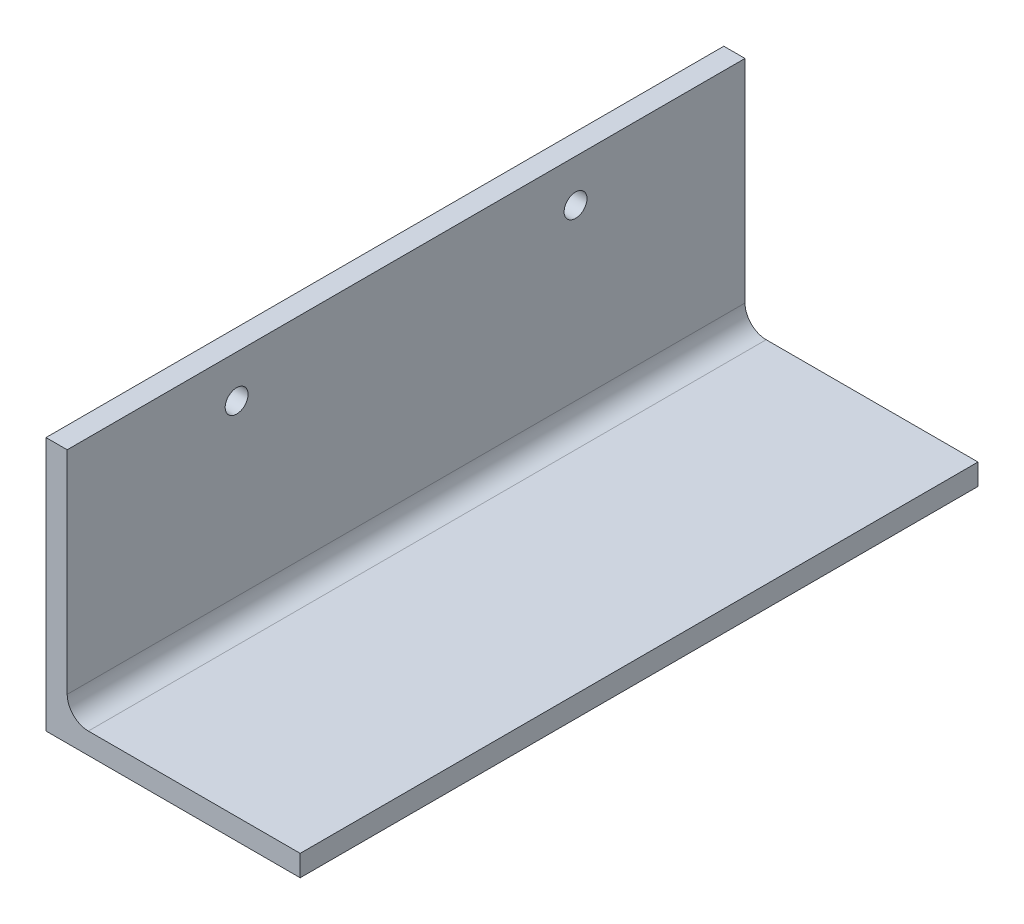
ISO-10303-21;
HEADER;
FILE_DESCRIPTION(('STEP AP214'),'2;1');
FILE_NAME('part.step','',(''),(''),'','','');
FILE_SCHEMA(('AUTOMOTIVE_DESIGN { 1 0 10303 214 1 1 1 1 }'));
ENDSEC;
DATA;
#1=APPLICATION_CONTEXT('core data for automotive mechanical design processes');
#2=APPLICATION_PROTOCOL_DEFINITION('international standard','automotive_design',2000,#1);
#3=PRODUCT_CONTEXT('',#1,'mechanical');
#4=PRODUCT('Part','Part','',(#3));
#5=PRODUCT_RELATED_PRODUCT_CATEGORY('part','',(#4));
#6=PRODUCT_DEFINITION_FORMATION('','',#4);
#7=PRODUCT_DEFINITION_CONTEXT('part definition',#1,'design');
#8=PRODUCT_DEFINITION('design','',#6,#7);
#9=PRODUCT_DEFINITION_SHAPE('','',#8);
#10=(LENGTH_UNIT() NAMED_UNIT(*) SI_UNIT(.MILLI.,.METRE.));
#11=(NAMED_UNIT(*) PLANE_ANGLE_UNIT() SI_UNIT($,.RADIAN.));
#12=(NAMED_UNIT(*) SI_UNIT($,.STERADIAN.) SOLID_ANGLE_UNIT());
#13=UNCERTAINTY_MEASURE_WITH_UNIT(LENGTH_MEASURE(1.E-05),#10,'distance_accuracy_value','');
#14=(GEOMETRIC_REPRESENTATION_CONTEXT(3) GLOBAL_UNCERTAINTY_ASSIGNED_CONTEXT((#13)) GLOBAL_UNIT_ASSIGNED_CONTEXT((#10,
#11,#12)) REPRESENTATION_CONTEXT('',''));
#15=CARTESIAN_POINT('',(0.,0.,0.));
#16=DIRECTION('',(0.,0.,1.));
#17=DIRECTION('',(1.,0.,0.));
#18=AXIS2_PLACEMENT_3D('',#15,#16,#17);
#19=CARTESIAN_POINT('',(0.,76.2,203.2));
#20=DIRECTION('',(1.,0.,0.));
#21=DIRECTION('',(0.,1.,0.));
#22=AXIS2_PLACEMENT_3D('',#19,#20,#21);
#23=PLANE('',#22);
#24=CARTESIAN_POINT('',(0.,63.5,50.8));
#25=DIRECTION('',(1.,0.,0.));
#26=DIRECTION('',(0.,1.,0.));
#27=AXIS2_PLACEMENT_3D('',#24,#25,#26);
#28=CIRCLE('',#27,3.429);
#29=CARTESIAN_POINT('',(0.,66.929,50.8));
#30=VERTEX_POINT('',#29);
#31=EDGE_CURVE('E128',#30,#30,#28,.T.);
#32=ORIENTED_EDGE('',*,*,#31,.T.);
#33=EDGE_LOOP('',(#32));
#34=FACE_BOUND('',#33,.T.);
#35=CARTESIAN_POINT('',(0.,63.5,152.4));
#36=DIRECTION('',(1.,0.,0.));
#37=DIRECTION('',(0.,1.,0.));
#38=AXIS2_PLACEMENT_3D('',#35,#36,#37);
#39=CIRCLE('',#38,3.429);
#40=CARTESIAN_POINT('',(0.,66.929,152.4));
#41=VERTEX_POINT('',#40);
#42=EDGE_CURVE('E163',#41,#41,#39,.T.);
#43=ORIENTED_EDGE('',*,*,#42,.T.);
#44=EDGE_LOOP('',(#43));
#45=FACE_BOUND('',#44,.T.);
#46=DIRECTION('',(0.,-1.,0.));
#47=VECTOR('',#46,1.);
#48=CARTESIAN_POINT('',(0.,76.2,0.));
#49=LINE('',#48,#47);
#50=CARTESIAN_POINT('',(0.,76.2,0.));
#51=VERTEX_POINT('',#50);
#52=CARTESIAN_POINT('',(0.,0.,0.));
#53=VERTEX_POINT('',#52);
#54=EDGE_CURVE('E124',#51,#53,#49,.T.);
#55=ORIENTED_EDGE('',*,*,#54,.T.);
#56=DIRECTION('',(0.,0.,-1.));
#57=VECTOR('',#56,1.);
#58=CARTESIAN_POINT('',(0.,0.,203.2));
#59=LINE('',#58,#57);
#60=CARTESIAN_POINT('',(0.,0.,203.2));
#61=VERTEX_POINT('',#60);
#62=EDGE_CURVE('E11',#61,#53,#59,.T.);
#63=ORIENTED_EDGE('',*,*,#62,.F.);
#64=DIRECTION('',(0.,-1.,0.));
#65=VECTOR('',#64,1.);
#66=CARTESIAN_POINT('',(0.,76.2,203.2));
#67=LINE('',#66,#65);
#68=CARTESIAN_POINT('',(0.,76.2,203.2));
#69=VERTEX_POINT('',#68);
#70=EDGE_CURVE('E137',#69,#61,#67,.T.);
#71=ORIENTED_EDGE('',*,*,#70,.F.);
#72=DIRECTION('',(0.,0.,-1.));
#73=VECTOR('',#72,1.);
#74=CARTESIAN_POINT('',(0.,76.2,203.2));
#75=LINE('',#74,#73);
#76=EDGE_CURVE('E120',#69,#51,#75,.T.);
#77=ORIENTED_EDGE('',*,*,#76,.T.);
#78=EDGE_LOOP('',(#55,#63,#71,#77));
#79=FACE_BOUND('',#78,.T.);
#80=ADVANCED_FACE('F34',(#34,#45,#79),#23,.F.);
#81=CARTESIAN_POINT('',(0.,0.,203.2));
#82=DIRECTION('',(0.,1.,0.));
#83=DIRECTION('',(0.,0.,1.));
#84=AXIS2_PLACEMENT_3D('',#81,#82,#83);
#85=PLANE('',#84);
#86=DIRECTION('',(1.,0.,0.));
#87=VECTOR('',#86,1.);
#88=CARTESIAN_POINT('',(0.,0.,0.));
#89=LINE('',#88,#87);
#90=CARTESIAN_POINT('',(76.2,0.,0.));
#91=VERTEX_POINT('',#90);
#92=EDGE_CURVE('E127',#53,#91,#89,.T.);
#93=ORIENTED_EDGE('',*,*,#92,.T.);
#94=DIRECTION('',(0.,0.,-1.));
#95=VECTOR('',#94,1.);
#96=CARTESIAN_POINT('',(76.2,0.,203.2));
#97=LINE('',#96,#95);
#98=CARTESIAN_POINT('',(76.2,0.,203.2));
#99=VERTEX_POINT('',#98);
#100=EDGE_CURVE('E42',#99,#91,#97,.T.);
#101=ORIENTED_EDGE('',*,*,#100,.F.);
#102=DIRECTION('',(1.,0.,0.));
#103=VECTOR('',#102,1.);
#104=CARTESIAN_POINT('',(0.,0.,203.2));
#105=LINE('',#104,#103);
#106=EDGE_CURVE('E90',#61,#99,#105,.T.);
#107=ORIENTED_EDGE('',*,*,#106,.F.);
#108=ORIENTED_EDGE('',*,*,#62,.T.);
#109=EDGE_LOOP('',(#93,#101,#107,#108));
#110=FACE_BOUND('',#109,.T.);
#111=ADVANCED_FACE('F197',(#110),#85,.F.);
#112=CARTESIAN_POINT('',(76.2,0.,203.2));
#113=DIRECTION('',(-1.,0.,0.));
#114=DIRECTION('',(0.,0.,1.));
#115=AXIS2_PLACEMENT_3D('',#112,#113,#114);
#116=PLANE('',#115);
#117=DIRECTION('',(0.,1.,0.));
#118=VECTOR('',#117,1.);
#119=CARTESIAN_POINT('',(76.2,0.,0.));
#120=LINE('',#119,#118);
#121=CARTESIAN_POINT('',(76.2,6.35,0.));
#122=VERTEX_POINT('',#121);
#123=EDGE_CURVE('E130',#91,#122,#120,.T.);
#124=ORIENTED_EDGE('',*,*,#123,.T.);
#125=DIRECTION('',(0.,0.,-1.));
#126=VECTOR('',#125,1.);
#127=CARTESIAN_POINT('',(76.2,6.35,203.2));
#128=LINE('',#127,#126);
#129=CARTESIAN_POINT('',(76.2,6.35,203.2));
#130=VERTEX_POINT('',#129);
#131=EDGE_CURVE('E141',#130,#122,#128,.T.);
#132=ORIENTED_EDGE('',*,*,#131,.F.);
#133=DIRECTION('',(0.,1.,0.));
#134=VECTOR('',#133,1.);
#135=CARTESIAN_POINT('',(76.2,0.,203.2));
#136=LINE('',#135,#134);
#137=EDGE_CURVE('E149',#99,#130,#136,.T.);
#138=ORIENTED_EDGE('',*,*,#137,.F.);
#139=ORIENTED_EDGE('',*,*,#100,.T.);
#140=EDGE_LOOP('',(#124,#132,#138,#139));
#141=FACE_BOUND('',#140,.T.);
#142=ADVANCED_FACE('F147',(#141),#116,.F.);
#143=CARTESIAN_POINT('',(76.2,6.35,203.2));
#144=DIRECTION('',(0.,-1.,0.));
#145=DIRECTION('',(1.,0.,0.));
#146=AXIS2_PLACEMENT_3D('',#143,#144,#145);
#147=PLANE('',#146);
#148=DIRECTION('',(-1.,0.,0.));
#149=VECTOR('',#148,1.);
#150=CARTESIAN_POINT('',(76.2,6.35,0.));
#151=LINE('',#150,#149);
#152=CARTESIAN_POINT('',(12.7,6.34999999999999,0.));
#153=VERTEX_POINT('',#152);
#154=EDGE_CURVE('E132',#122,#153,#151,.T.);
#155=ORIENTED_EDGE('',*,*,#154,.T.);
#156=DIRECTION('',(0.,0.,-1.));
#157=VECTOR('',#156,1.);
#158=CARTESIAN_POINT('',(12.7,6.34999999999999,203.2));
#159=LINE('',#158,#157);
#160=CARTESIAN_POINT('',(12.7,6.34999999999999,203.2));
#161=VERTEX_POINT('',#160);
#162=EDGE_CURVE('E115',#161,#153,#159,.T.);
#163=ORIENTED_EDGE('',*,*,#162,.F.);
#164=DIRECTION('',(-1.,0.,0.));
#165=VECTOR('',#164,1.);
#166=CARTESIAN_POINT('',(76.2,6.35,203.2));
#167=LINE('',#166,#165);
#168=EDGE_CURVE('E106',#130,#161,#167,.T.);
#169=ORIENTED_EDGE('',*,*,#168,.F.);
#170=ORIENTED_EDGE('',*,*,#131,.T.);
#171=EDGE_LOOP('',(#155,#163,#169,#170));
#172=FACE_BOUND('',#171,.T.);
#173=ADVANCED_FACE('F155',(#172),#147,.F.);
#174=CARTESIAN_POINT('',(12.7,12.7,203.2));
#175=DIRECTION('',(0.,0.,-1.));
#176=DIRECTION('',(-1.,0.,0.));
#177=AXIS2_PLACEMENT_3D('',#174,#175,#176);
#178=CYLINDRICAL_SURFACE('',#177,6.35);
#179=CARTESIAN_POINT('',(12.7,12.7,0.));
#180=DIRECTION('',(0.,0.,-1.));
#181=DIRECTION('',(-1.,0.,0.));
#182=AXIS2_PLACEMENT_3D('',#179,#180,#181);
#183=CIRCLE('',#182,6.35);
#184=CARTESIAN_POINT('',(6.35,12.7,0.));
#185=VERTEX_POINT('',#184);
#186=EDGE_CURVE('E114',#153,#185,#183,.T.);
#187=ORIENTED_EDGE('',*,*,#186,.T.);
#188=DIRECTION('',(0.,0.,-1.));
#189=VECTOR('',#188,1.);
#190=CARTESIAN_POINT('',(6.35,12.7,203.2));
#191=LINE('',#190,#189);
#192=CARTESIAN_POINT('',(6.35,12.7,203.2));
#193=VERTEX_POINT('',#192);
#194=EDGE_CURVE('E111',#193,#185,#191,.T.);
#195=ORIENTED_EDGE('',*,*,#194,.F.);
#196=CARTESIAN_POINT('',(12.7,12.7,203.2));
#197=DIRECTION('',(0.,0.,-1.));
#198=DIRECTION('',(-1.,0.,0.));
#199=AXIS2_PLACEMENT_3D('',#196,#197,#198);
#200=CIRCLE('',#199,6.35);
#201=EDGE_CURVE('E100',#161,#193,#200,.T.);
#202=ORIENTED_EDGE('',*,*,#201,.F.);
#203=ORIENTED_EDGE('',*,*,#162,.T.);
#204=EDGE_LOOP('',(#187,#195,#202,#203));
#205=FACE_BOUND('',#204,.T.);
#206=ADVANCED_FACE('F112',(#205),#178,.F.);
#207=CARTESIAN_POINT('',(6.35,12.7,203.2));
#208=DIRECTION('',(-1.,0.,0.));
#209=DIRECTION('',(0.,-1.,0.));
#210=AXIS2_PLACEMENT_3D('',#207,#208,#209);
#211=PLANE('',#210);
#212=CARTESIAN_POINT('',(6.35,63.5,50.8));
#213=DIRECTION('',(1.,0.,0.));
#214=DIRECTION('',(0.,1.,0.));
#215=AXIS2_PLACEMENT_3D('',#212,#213,#214);
#216=CIRCLE('',#215,3.429);
#217=CARTESIAN_POINT('',(6.35,66.929,50.8));
#218=VERTEX_POINT('',#217);
#219=EDGE_CURVE('E166',#218,#218,#216,.T.);
#220=ORIENTED_EDGE('',*,*,#219,.F.);
#221=EDGE_LOOP('',(#220));
#222=FACE_BOUND('',#221,.T.);
#223=CARTESIAN_POINT('',(6.35,63.5,152.4));
#224=DIRECTION('',(1.,0.,0.));
#225=DIRECTION('',(0.,1.,0.));
#226=AXIS2_PLACEMENT_3D('',#223,#224,#225);
#227=CIRCLE('',#226,3.429);
#228=CARTESIAN_POINT('',(6.35,66.929,152.4));
#229=VERTEX_POINT('',#228);
#230=EDGE_CURVE('E160',#229,#229,#227,.T.);
#231=ORIENTED_EDGE('',*,*,#230,.F.);
#232=EDGE_LOOP('',(#231));
#233=FACE_BOUND('',#232,.T.);
#234=DIRECTION('',(0.,1.,0.));
#235=VECTOR('',#234,1.);
#236=CARTESIAN_POINT('',(6.35,12.7,0.));
#237=LINE('',#236,#235);
#238=CARTESIAN_POINT('',(6.35,76.2,0.));
#239=VERTEX_POINT('',#238);
#240=EDGE_CURVE('E76',#185,#239,#237,.T.);
#241=ORIENTED_EDGE('',*,*,#240,.T.);
#242=DIRECTION('',(0.,0.,-1.));
#243=VECTOR('',#242,1.);
#244=CARTESIAN_POINT('',(6.35,76.2,203.2));
#245=LINE('',#244,#243);
#246=CARTESIAN_POINT('',(6.35,76.2,203.2));
#247=VERTEX_POINT('',#246);
#248=EDGE_CURVE('E116',#247,#239,#245,.T.);
#249=ORIENTED_EDGE('',*,*,#248,.F.);
#250=DIRECTION('',(0.,1.,0.));
#251=VECTOR('',#250,1.);
#252=CARTESIAN_POINT('',(6.35,12.7,203.2));
#253=LINE('',#252,#251);
#254=EDGE_CURVE('E104',#193,#247,#253,.T.);
#255=ORIENTED_EDGE('',*,*,#254,.F.);
#256=ORIENTED_EDGE('',*,*,#194,.T.);
#257=EDGE_LOOP('',(#241,#249,#255,#256));
#258=FACE_BOUND('',#257,.T.);
#259=ADVANCED_FACE('F118',(#222,#233,#258),#211,.F.);
#260=CARTESIAN_POINT('',(6.35,76.2,203.2));
#261=DIRECTION('',(0.,-1.,0.));
#262=DIRECTION('',(0.,0.,-1.));
#263=AXIS2_PLACEMENT_3D('',#260,#261,#262);
#264=PLANE('',#263);
#265=DIRECTION('',(-1.,0.,0.));
#266=VECTOR('',#265,1.);
#267=CARTESIAN_POINT('',(6.35,76.2,0.));
#268=LINE('',#267,#266);
#269=EDGE_CURVE('E82',#239,#51,#268,.T.);
#270=ORIENTED_EDGE('',*,*,#269,.T.);
#271=ORIENTED_EDGE('',*,*,#76,.F.);
#272=DIRECTION('',(-1.,0.,0.));
#273=VECTOR('',#272,1.);
#274=CARTESIAN_POINT('',(6.35,76.2,203.2));
#275=LINE('',#274,#273);
#276=EDGE_CURVE('E50',#247,#69,#275,.T.);
#277=ORIENTED_EDGE('',*,*,#276,.F.);
#278=ORIENTED_EDGE('',*,*,#248,.T.);
#279=EDGE_LOOP('',(#270,#271,#277,#278));
#280=FACE_BOUND('',#279,.T.);
#281=ADVANCED_FACE('F183',(#280),#264,.F.);
#282=CARTESIAN_POINT('',(12.7,12.7,203.2));
#283=DIRECTION('',(0.,0.,-1.));
#284=DIRECTION('',(-1.,0.,0.));
#285=AXIS2_PLACEMENT_3D('',#282,#283,#284);
#286=PLANE('',#285);
#287=ORIENTED_EDGE('',*,*,#70,.T.);
#288=ORIENTED_EDGE('',*,*,#106,.T.);
#289=ORIENTED_EDGE('',*,*,#137,.T.);
#290=ORIENTED_EDGE('',*,*,#168,.T.);
#291=ORIENTED_EDGE('',*,*,#201,.T.);
#292=ORIENTED_EDGE('',*,*,#254,.T.);
#293=ORIENTED_EDGE('',*,*,#276,.T.);
#294=EDGE_LOOP('',(#287,#288,#289,#290,#291,#292,#293));
#295=FACE_BOUND('',#294,.T.);
#296=ADVANCED_FACE('F102',(#295),#286,.F.);
#297=CARTESIAN_POINT('',(12.7,12.7,0.));
#298=DIRECTION('',(0.,0.,-1.));
#299=DIRECTION('',(-1.,0.,0.));
#300=AXIS2_PLACEMENT_3D('',#297,#298,#299);
#301=PLANE('',#300);
#302=ORIENTED_EDGE('',*,*,#54,.F.);
#303=ORIENTED_EDGE('',*,*,#269,.F.);
#304=ORIENTED_EDGE('',*,*,#240,.F.);
#305=ORIENTED_EDGE('',*,*,#186,.F.);
#306=ORIENTED_EDGE('',*,*,#154,.F.);
#307=ORIENTED_EDGE('',*,*,#123,.F.);
#308=ORIENTED_EDGE('',*,*,#92,.F.);
#309=EDGE_LOOP('',(#302,#303,#304,#305,#306,#307,#308));
#310=FACE_BOUND('',#309,.T.);
#311=ADVANCED_FACE('F153',(#310),#301,.T.);
#312=CARTESIAN_POINT('',(0.,63.5,152.4));
#313=DIRECTION('',(1.,0.,0.));
#314=DIRECTION('',(0.,1.,0.));
#315=AXIS2_PLACEMENT_3D('',#312,#313,#314);
#316=CYLINDRICAL_SURFACE('',#315,3.429);
#317=ORIENTED_EDGE('',*,*,#42,.F.);
#318=EDGE_LOOP('',(#317));
#319=FACE_BOUND('',#318,.T.);
#320=ORIENTED_EDGE('',*,*,#230,.T.);
#321=EDGE_LOOP('',(#320));
#322=FACE_BOUND('',#321,.T.);
#323=ADVANCED_FACE('F177',(#319,#322),#316,.F.);
#324=CARTESIAN_POINT('',(0.,63.5,50.8));
#325=DIRECTION('',(1.,0.,0.));
#326=DIRECTION('',(0.,1.,0.));
#327=AXIS2_PLACEMENT_3D('',#324,#325,#326);
#328=CYLINDRICAL_SURFACE('',#327,3.429);
#329=ORIENTED_EDGE('',*,*,#31,.F.);
#330=EDGE_LOOP('',(#329));
#331=FACE_BOUND('',#330,.T.);
#332=ORIENTED_EDGE('',*,*,#219,.T.);
#333=EDGE_LOOP('',(#332));
#334=FACE_BOUND('',#333,.T.);
#335=ADVANCED_FACE('F174',(#331,#334),#328,.F.);
#336=CLOSED_SHELL('',(#80,#111,#142,#173,#206,#259,#281,#296,#311,#323,#335));
#337=MANIFOLD_SOLID_BREP('B2',#336);
#338=ADVANCED_BREP_SHAPE_REPRESENTATION('',(#18,#337),#14);
#339=SHAPE_DEFINITION_REPRESENTATION(#9,#338);
ENDSEC;
END-ISO-10303-21;
